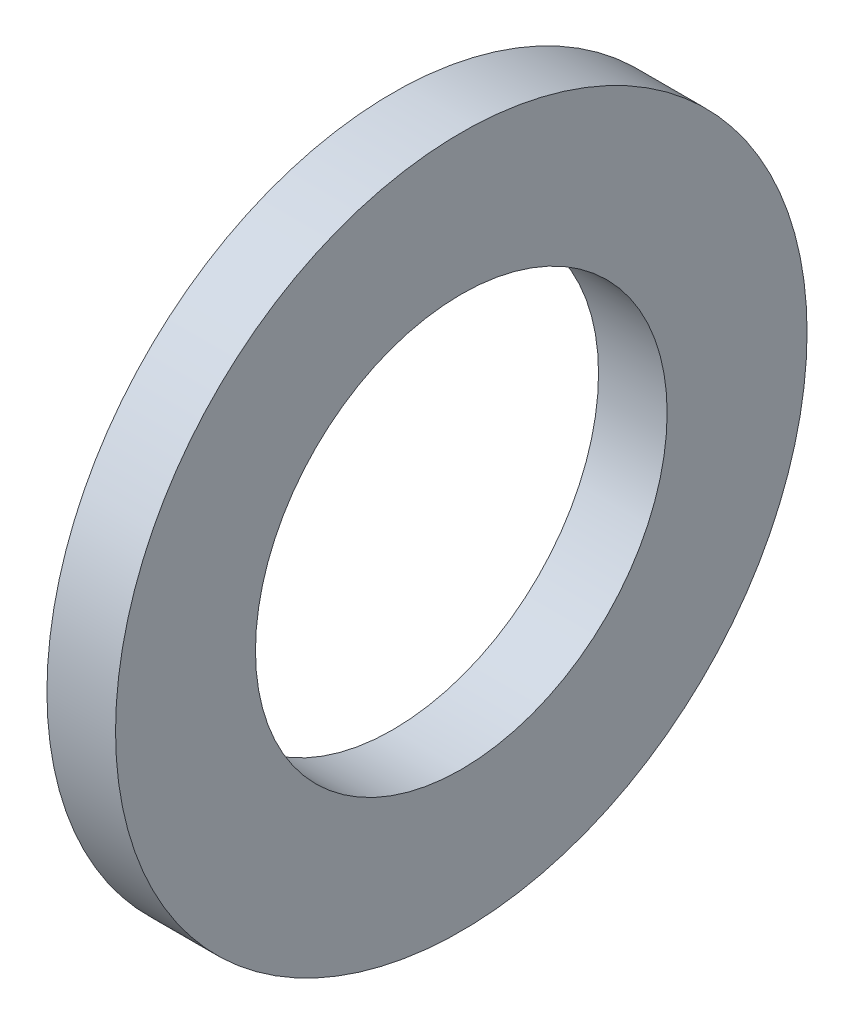
ISO-10303-21;
HEADER;
FILE_DESCRIPTION(('STEP AP214'),'2;1');
FILE_NAME('part.step','',(''),(''),'','','');
FILE_SCHEMA(('AUTOMOTIVE_DESIGN { 1 0 10303 214 1 1 1 1 }'));
ENDSEC;
DATA;
#1=APPLICATION_CONTEXT('core data for automotive mechanical design processes');
#2=APPLICATION_PROTOCOL_DEFINITION('international standard','automotive_design',2000,#1);
#3=PRODUCT_CONTEXT('',#1,'mechanical');
#4=PRODUCT('Part','Part','',(#3));
#5=PRODUCT_RELATED_PRODUCT_CATEGORY('part','',(#4));
#6=PRODUCT_DEFINITION_FORMATION('','',#4);
#7=PRODUCT_DEFINITION_CONTEXT('part definition',#1,'design');
#8=PRODUCT_DEFINITION('design','',#6,#7);
#9=PRODUCT_DEFINITION_SHAPE('','',#8);
#10=(LENGTH_UNIT() NAMED_UNIT(*) SI_UNIT(.MILLI.,.METRE.));
#11=(NAMED_UNIT(*) PLANE_ANGLE_UNIT() SI_UNIT($,.RADIAN.));
#12=(NAMED_UNIT(*) SI_UNIT($,.STERADIAN.) SOLID_ANGLE_UNIT());
#13=UNCERTAINTY_MEASURE_WITH_UNIT(LENGTH_MEASURE(1.E-05),#10,'distance_accuracy_value','');
#14=(GEOMETRIC_REPRESENTATION_CONTEXT(3) GLOBAL_UNCERTAINTY_ASSIGNED_CONTEXT((#13)) GLOBAL_UNIT_ASSIGNED_CONTEXT((#10,
#11,#12)) REPRESENTATION_CONTEXT('',''));
#15=CARTESIAN_POINT('',(0.,0.,0.));
#16=DIRECTION('',(0.,0.,1.));
#17=DIRECTION('',(1.,0.,0.));
#18=AXIS2_PLACEMENT_3D('',#15,#16,#17);
#19=CARTESIAN_POINT('',(0.79375,0.,0.));
#20=DIRECTION('',(1.,0.,0.));
#21=DIRECTION('',(0.,0.,-1.));
#22=AXIS2_PLACEMENT_3D('',#19,#20,#21);
#23=PLANE('',#22);
#24=CARTESIAN_POINT('',(0.79375,0.,0.));
#25=DIRECTION('',(1.,0.,0.));
#26=DIRECTION('',(0.,0.,-1.));
#27=AXIS2_PLACEMENT_3D('',#24,#25,#26);
#28=CIRCLE('',#27,4.);
#29=CARTESIAN_POINT('',(0.79375,0.,-4.));
#30=VERTEX_POINT('',#29);
#31=EDGE_CURVE('E10',#30,#30,#28,.T.);
#32=ORIENTED_EDGE('',*,*,#31,.T.);
#33=EDGE_LOOP('',(#32));
#34=FACE_BOUND('',#33,.T.);
#35=CARTESIAN_POINT('',(0.79375,0.,0.));
#36=DIRECTION('',(1.,0.,0.));
#37=DIRECTION('',(0.,0.,-1.));
#38=AXIS2_PLACEMENT_3D('',#35,#36,#37);
#39=CIRCLE('',#38,2.38125);
#40=CARTESIAN_POINT('',(0.79375,0.,-2.38125));
#41=VERTEX_POINT('',#40);
#42=EDGE_CURVE('E50',#41,#41,#39,.T.);
#43=ORIENTED_EDGE('',*,*,#42,.F.);
#44=EDGE_LOOP('',(#43));
#45=FACE_BOUND('',#44,.T.);
#46=ADVANCED_FACE('F37',(#34,#45),#23,.T.);
#47=CARTESIAN_POINT('',(0.,0.,0.));
#48=DIRECTION('',(1.,0.,0.));
#49=DIRECTION('',(0.,0.,-1.));
#50=AXIS2_PLACEMENT_3D('',#47,#48,#49);
#51=PLANE('',#50);
#52=CARTESIAN_POINT('',(0.,0.,0.));
#53=DIRECTION('',(1.,0.,0.));
#54=DIRECTION('',(0.,0.,-1.));
#55=AXIS2_PLACEMENT_3D('',#52,#53,#54);
#56=CIRCLE('',#55,4.);
#57=CARTESIAN_POINT('',(0.,0.,-4.));
#58=VERTEX_POINT('',#57);
#59=EDGE_CURVE('E41',#58,#58,#56,.T.);
#60=ORIENTED_EDGE('',*,*,#59,.F.);
#61=EDGE_LOOP('',(#60));
#62=FACE_BOUND('',#61,.T.);
#63=CARTESIAN_POINT('',(0.,0.,0.));
#64=DIRECTION('',(1.,0.,0.));
#65=DIRECTION('',(0.,0.,-1.));
#66=AXIS2_PLACEMENT_3D('',#63,#64,#65);
#67=CIRCLE('',#66,2.38125);
#68=CARTESIAN_POINT('',(0.,0.,-2.38125));
#69=VERTEX_POINT('',#68);
#70=EDGE_CURVE('E52',#69,#69,#67,.T.);
#71=ORIENTED_EDGE('',*,*,#70,.T.);
#72=EDGE_LOOP('',(#71));
#73=FACE_BOUND('',#72,.T.);
#74=ADVANCED_FACE('F64',(#62,#73),#51,.F.);
#75=CARTESIAN_POINT('',(0.79375,0.,0.));
#76=DIRECTION('',(-1.,0.,0.));
#77=DIRECTION('',(0.,0.,1.));
#78=AXIS2_PLACEMENT_3D('',#75,#76,#77);
#79=CYLINDRICAL_SURFACE('',#78,4.);
#80=ORIENTED_EDGE('',*,*,#31,.F.);
#81=EDGE_LOOP('',(#80));
#82=FACE_BOUND('',#81,.T.);
#83=ORIENTED_EDGE('',*,*,#59,.T.);
#84=EDGE_LOOP('',(#83));
#85=FACE_BOUND('',#84,.T.);
#86=ADVANCED_FACE('F39',(#82,#85),#79,.T.);
#87=CARTESIAN_POINT('',(0.79375,0.,0.));
#88=DIRECTION('',(-1.,0.,0.));
#89=DIRECTION('',(0.,0.,1.));
#90=AXIS2_PLACEMENT_3D('',#87,#88,#89);
#91=CYLINDRICAL_SURFACE('',#90,2.38125);
#92=ORIENTED_EDGE('',*,*,#42,.T.);
#93=EDGE_LOOP('',(#92));
#94=FACE_BOUND('',#93,.T.);
#95=ORIENTED_EDGE('',*,*,#70,.F.);
#96=EDGE_LOOP('',(#95));
#97=FACE_BOUND('',#96,.T.);
#98=ADVANCED_FACE('F60',(#94,#97),#91,.F.);
#99=CLOSED_SHELL('',(#46,#74,#86,#98));
#100=MANIFOLD_SOLID_BREP('B2',#99);
#101=ADVANCED_BREP_SHAPE_REPRESENTATION('',(#18,#100),#14);
#102=SHAPE_DEFINITION_REPRESENTATION(#9,#101);
ENDSEC;
END-ISO-10303-21;
